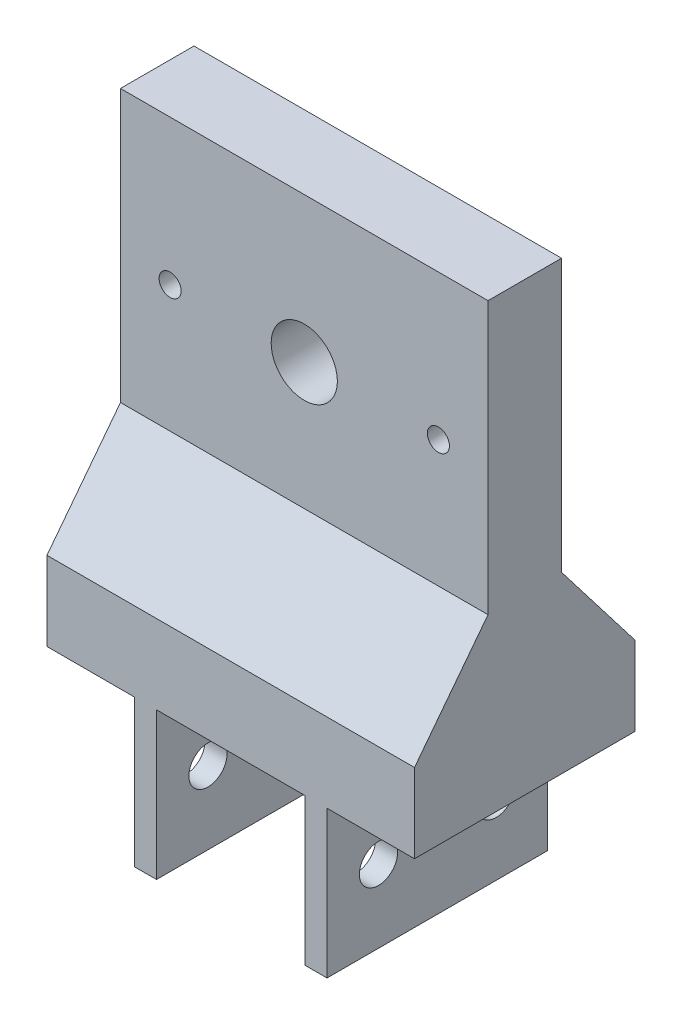
ISO-10303-21;
HEADER;
FILE_DESCRIPTION(('STEP AP214'),'2;1');
FILE_NAME('part.step','',(''),(''),'','','');
FILE_SCHEMA(('AUTOMOTIVE_DESIGN { 1 0 10303 214 1 1 1 1 }'));
ENDSEC;
DATA;
#1=APPLICATION_CONTEXT('core data for automotive mechanical design processes');
#2=APPLICATION_PROTOCOL_DEFINITION('international standard','automotive_design',2000,#1);
#3=PRODUCT_CONTEXT('',#1,'mechanical');
#4=PRODUCT('Part','Part','',(#3));
#5=PRODUCT_RELATED_PRODUCT_CATEGORY('part','',(#4));
#6=PRODUCT_DEFINITION_FORMATION('','',#4);
#7=PRODUCT_DEFINITION_CONTEXT('part definition',#1,'design');
#8=PRODUCT_DEFINITION('design','',#6,#7);
#9=PRODUCT_DEFINITION_SHAPE('','',#8);
#10=(LENGTH_UNIT() NAMED_UNIT(*) SI_UNIT(.MILLI.,.METRE.));
#11=(NAMED_UNIT(*) PLANE_ANGLE_UNIT() SI_UNIT($,.RADIAN.));
#12=(NAMED_UNIT(*) SI_UNIT($,.STERADIAN.) SOLID_ANGLE_UNIT());
#13=UNCERTAINTY_MEASURE_WITH_UNIT(LENGTH_MEASURE(1.E-05),#10,'distance_accuracy_value','');
#14=(GEOMETRIC_REPRESENTATION_CONTEXT(3) GLOBAL_UNCERTAINTY_ASSIGNED_CONTEXT((#13)) GLOBAL_UNIT_ASSIGNED_CONTEXT((#10,
#11,#12)) REPRESENTATION_CONTEXT('',''));
#15=CARTESIAN_POINT('',(0.,0.,0.));
#16=DIRECTION('',(0.,0.,1.));
#17=DIRECTION('',(1.,0.,0.));
#18=AXIS2_PLACEMENT_3D('',#15,#16,#17);
#19=CARTESIAN_POINT('',(13.1,0.,30.));
#20=DIRECTION('',(1.,0.,0.));
#21=DIRECTION('',(0.,1.,0.));
#22=AXIS2_PLACEMENT_3D('',#19,#20,#21);
#23=PLANE('',#22);
#24=CARTESIAN_POINT('',(13.1,-15.375,7.));
#25=DIRECTION('',(1.,0.,0.));
#26=DIRECTION('',(0.,1.,0.));
#27=AXIS2_PLACEMENT_3D('',#24,#25,#26);
#28=CIRCLE('',#27,2.60000000000001);
#29=CARTESIAN_POINT('',(13.1,-12.775,7.));
#30=VERTEX_POINT('',#29);
#31=EDGE_CURVE('E292',#30,#30,#28,.T.);
#32=ORIENTED_EDGE('',*,*,#31,.F.);
#33=EDGE_LOOP('',(#32));
#34=FACE_BOUND('',#33,.T.);
#35=CARTESIAN_POINT('',(13.1,-15.375,23.));
#36=DIRECTION('',(1.,0.,0.));
#37=DIRECTION('',(0.,1.,0.));
#38=AXIS2_PLACEMENT_3D('',#35,#36,#37);
#39=CIRCLE('',#38,2.60000000000001);
#40=CARTESIAN_POINT('',(13.1,-12.775,23.));
#41=VERTEX_POINT('',#40);
#42=EDGE_CURVE('E299',#41,#41,#39,.T.);
#43=ORIENTED_EDGE('',*,*,#42,.F.);
#44=EDGE_LOOP('',(#43));
#45=FACE_BOUND('',#44,.T.);
#46=DIRECTION('',(0.,-1.,0.));
#47=VECTOR('',#46,1.);
#48=CARTESIAN_POINT('',(13.1,0.,0.));
#49=LINE('',#48,#47);
#50=CARTESIAN_POINT('',(13.1,-5.375,0.));
#51=VERTEX_POINT('',#50);
#52=CARTESIAN_POINT('',(13.1,-25.375,0.));
#53=VERTEX_POINT('',#52);
#54=EDGE_CURVE('E199',#51,#53,#49,.T.);
#55=ORIENTED_EDGE('',*,*,#54,.F.);
#56=DIRECTION('',(0.,0.,-1.));
#57=VECTOR('',#56,1.);
#58=CARTESIAN_POINT('',(13.1,-5.375,30.));
#59=LINE('',#58,#57);
#60=CARTESIAN_POINT('',(13.1,-5.375,30.));
#61=VERTEX_POINT('',#60);
#62=EDGE_CURVE('E251',#61,#51,#59,.T.);
#63=ORIENTED_EDGE('',*,*,#62,.F.);
#64=DIRECTION('',(0.,-1.,0.));
#65=VECTOR('',#64,1.);
#66=CARTESIAN_POINT('',(13.1,0.,30.));
#67=LINE('',#66,#65);
#68=CARTESIAN_POINT('',(13.1,-25.375,30.));
#69=VERTEX_POINT('',#68);
#70=EDGE_CURVE('E229',#61,#69,#67,.T.);
#71=ORIENTED_EDGE('',*,*,#70,.T.);
#72=DIRECTION('',(0.,0.,-1.));
#73=VECTOR('',#72,1.);
#74=CARTESIAN_POINT('',(13.1,-25.375,30.));
#75=LINE('',#74,#73);
#76=EDGE_CURVE('E198',#69,#53,#75,.T.);
#77=ORIENTED_EDGE('',*,*,#76,.T.);
#78=EDGE_LOOP('',(#55,#63,#71,#77));
#79=FACE_BOUND('',#78,.T.);
#80=ADVANCED_FACE('F41',(#34,#45,#79),#23,.T.);
#81=CARTESIAN_POINT('',(0.,-5.375,30.));
#82=DIRECTION('',(0.,1.,0.));
#83=DIRECTION('',(0.,0.,1.));
#84=AXIS2_PLACEMENT_3D('',#81,#82,#83);
#85=PLANE('',#84);
#86=DIRECTION('',(1.,0.,0.));
#87=VECTOR('',#86,1.);
#88=CARTESIAN_POINT('',(0.,-5.375,0.));
#89=LINE('',#88,#87);
#90=CARTESIAN_POINT('',(25.,-5.375,0.));
#91=VERTEX_POINT('',#90);
#92=EDGE_CURVE('E202',#51,#91,#89,.T.);
#93=ORIENTED_EDGE('',*,*,#92,.T.);
#94=DIRECTION('',(0.,0.,-1.));
#95=VECTOR('',#94,1.);
#96=CARTESIAN_POINT('',(25.,-5.375,30.));
#97=LINE('',#96,#95);
#98=CARTESIAN_POINT('',(25.,-5.375,30.));
#99=VERTEX_POINT('',#98);
#100=EDGE_CURVE('E248',#99,#91,#97,.T.);
#101=ORIENTED_EDGE('',*,*,#100,.F.);
#102=DIRECTION('',(1.,0.,0.));
#103=VECTOR('',#102,1.);
#104=CARTESIAN_POINT('',(0.,-5.375,30.));
#105=LINE('',#104,#103);
#106=EDGE_CURVE('E320',#61,#99,#105,.T.);
#107=ORIENTED_EDGE('',*,*,#106,.F.);
#108=ORIENTED_EDGE('',*,*,#62,.T.);
#109=EDGE_LOOP('',(#93,#101,#107,#108));
#110=FACE_BOUND('',#109,.T.);
#111=ADVANCED_FACE('F324',(#110),#85,.F.);
#112=CARTESIAN_POINT('',(25.,0.,30.));
#113=DIRECTION('',(-1.,0.,0.));
#114=DIRECTION('',(0.,0.,1.));
#115=AXIS2_PLACEMENT_3D('',#112,#113,#114);
#116=PLANE('',#115);
#117=DIRECTION('',(0.,1.,0.));
#118=VECTOR('',#117,1.);
#119=CARTESIAN_POINT('',(25.,0.,0.));
#120=LINE('',#119,#118);
#121=CARTESIAN_POINT('',(25.,5.375,0.));
#122=VERTEX_POINT('',#121);
#123=EDGE_CURVE('E205',#91,#122,#120,.T.);
#124=ORIENTED_EDGE('',*,*,#123,.T.);
#125=DIRECTION('',(0.,0.7926239891046,0.609710760849693));
#126=VECTOR('',#125,1.);
#127=CARTESIAN_POINT('',(25.,18.375,10.));
#128=LINE('',#127,#126);
#129=CARTESIAN_POINT('',(25.,18.375,10.));
#130=VERTEX_POINT('',#129);
#131=EDGE_CURVE('E386',#122,#130,#128,.T.);
#132=ORIENTED_EDGE('',*,*,#131,.T.);
#133=DIRECTION('',(0.,-1.,0.));
#134=VECTOR('',#133,1.);
#135=CARTESIAN_POINT('',(25.,55.375,10.));
#136=LINE('',#135,#134);
#137=CARTESIAN_POINT('',(25.,55.375,10.));
#138=VERTEX_POINT('',#137);
#139=EDGE_CURVE('E55',#138,#130,#136,.T.);
#140=ORIENTED_EDGE('',*,*,#139,.F.);
#141=DIRECTION('',(0.,0.,-1.));
#142=VECTOR('',#141,1.);
#143=CARTESIAN_POINT('',(25.,55.375,10.));
#144=LINE('',#143,#142);
#145=CARTESIAN_POINT('',(25.,55.375,20.));
#146=VERTEX_POINT('',#145);
#147=EDGE_CURVE('E307',#146,#138,#144,.T.);
#148=ORIENTED_EDGE('',*,*,#147,.F.);
#149=DIRECTION('',(0.,-1.,0.));
#150=VECTOR('',#149,1.);
#151=CARTESIAN_POINT('',(25.,55.375,20.));
#152=LINE('',#151,#150);
#153=CARTESIAN_POINT('',(25.,18.375,20.));
#154=VERTEX_POINT('',#153);
#155=EDGE_CURVE('E314',#146,#154,#152,.T.);
#156=ORIENTED_EDGE('',*,*,#155,.T.);
#157=DIRECTION('',(0.,-0.7926239891046,0.609710760849692));
#158=VECTOR('',#157,1.);
#159=CARTESIAN_POINT('',(25.,18.375,20.));
#160=LINE('',#159,#158);
#161=CARTESIAN_POINT('',(25.,5.375,30.));
#162=VERTEX_POINT('',#161);
#163=EDGE_CURVE('E329',#154,#162,#160,.T.);
#164=ORIENTED_EDGE('',*,*,#163,.T.);
#165=DIRECTION('',(0.,1.,0.));
#166=VECTOR('',#165,1.);
#167=CARTESIAN_POINT('',(25.,0.,30.));
#168=LINE('',#167,#166);
#169=EDGE_CURVE('E173',#99,#162,#168,.T.);
#170=ORIENTED_EDGE('',*,*,#169,.F.);
#171=ORIENTED_EDGE('',*,*,#100,.T.);
#172=EDGE_LOOP('',(#124,#132,#140,#148,#156,#164,#170,#171));
#173=FACE_BOUND('',#172,.T.);
#174=ADVANCED_FACE('F328',(#173),#116,.F.);
#175=CARTESIAN_POINT('',(-25.,0.,30.));
#176=DIRECTION('',(-1.,0.,0.));
#177=DIRECTION('',(0.,0.,1.));
#178=AXIS2_PLACEMENT_3D('',#175,#176,#177);
#179=PLANE('',#178);
#180=DIRECTION('',(0.,-0.7926239891046,-0.609710760849693));
#181=VECTOR('',#180,1.);
#182=CARTESIAN_POINT('',(-25.,18.375,10.));
#183=LINE('',#182,#181);
#184=CARTESIAN_POINT('',(-25.,18.375,10.));
#185=VERTEX_POINT('',#184);
#186=CARTESIAN_POINT('',(-25.,5.375,0.));
#187=VERTEX_POINT('',#186);
#188=EDGE_CURVE('E165',#185,#187,#183,.T.);
#189=ORIENTED_EDGE('',*,*,#188,.T.);
#190=DIRECTION('',(0.,1.,0.));
#191=VECTOR('',#190,1.);
#192=CARTESIAN_POINT('',(-25.,0.,0.));
#193=LINE('',#192,#191);
#194=CARTESIAN_POINT('',(-25.,-5.375,0.));
#195=VERTEX_POINT('',#194);
#196=EDGE_CURVE('E210',#195,#187,#193,.T.);
#197=ORIENTED_EDGE('',*,*,#196,.F.);
#198=DIRECTION('',(0.,0.,-1.));
#199=VECTOR('',#198,1.);
#200=CARTESIAN_POINT('',(-25.,-5.375,30.));
#201=LINE('',#200,#199);
#202=CARTESIAN_POINT('',(-25.,-5.375,30.));
#203=VERTEX_POINT('',#202);
#204=EDGE_CURVE('E178',#203,#195,#201,.T.);
#205=ORIENTED_EDGE('',*,*,#204,.F.);
#206=DIRECTION('',(0.,1.,0.));
#207=VECTOR('',#206,1.);
#208=CARTESIAN_POINT('',(-25.,0.,30.));
#209=LINE('',#208,#207);
#210=CARTESIAN_POINT('',(-25.,5.375,30.));
#211=VERTEX_POINT('',#210);
#212=EDGE_CURVE('E171',#203,#211,#209,.T.);
#213=ORIENTED_EDGE('',*,*,#212,.T.);
#214=DIRECTION('',(0.,0.7926239891046,-0.609710760849692));
#215=VECTOR('',#214,1.);
#216=CARTESIAN_POINT('',(-25.,18.375,20.));
#217=LINE('',#216,#215);
#218=CARTESIAN_POINT('',(-25.,18.375,20.));
#219=VERTEX_POINT('',#218);
#220=EDGE_CURVE('E154',#211,#219,#217,.T.);
#221=ORIENTED_EDGE('',*,*,#220,.T.);
#222=DIRECTION('',(0.,-1.,0.));
#223=VECTOR('',#222,1.);
#224=CARTESIAN_POINT('',(-25.,55.375,20.));
#225=LINE('',#224,#223);
#226=CARTESIAN_POINT('',(-25.,55.375,20.));
#227=VERTEX_POINT('',#226);
#228=EDGE_CURVE('E203',#227,#219,#225,.T.);
#229=ORIENTED_EDGE('',*,*,#228,.F.);
#230=DIRECTION('',(0.,0.,1.));
#231=VECTOR('',#230,1.);
#232=CARTESIAN_POINT('',(-25.,55.375,10.));
#233=LINE('',#232,#231);
#234=CARTESIAN_POINT('',(-25.,55.375,10.));
#235=VERTEX_POINT('',#234);
#236=EDGE_CURVE('E302',#235,#227,#233,.T.);
#237=ORIENTED_EDGE('',*,*,#236,.F.);
#238=DIRECTION('',(0.,-1.,0.));
#239=VECTOR('',#238,1.);
#240=CARTESIAN_POINT('',(-25.,55.375,10.));
#241=LINE('',#240,#239);
#242=EDGE_CURVE('E311',#235,#185,#241,.T.);
#243=ORIENTED_EDGE('',*,*,#242,.T.);
#244=EDGE_LOOP('',(#189,#197,#205,#213,#221,#229,#237,#243));
#245=FACE_BOUND('',#244,.T.);
#246=ADVANCED_FACE('F176',(#245),#179,.T.);
#247=CARTESIAN_POINT('',(0.,-5.375,30.));
#248=DIRECTION('',(0.,1.,0.));
#249=DIRECTION('',(0.,0.,1.));
#250=AXIS2_PLACEMENT_3D('',#247,#248,#249);
#251=PLANE('',#250);
#252=DIRECTION('',(1.,0.,0.));
#253=VECTOR('',#252,1.);
#254=CARTESIAN_POINT('',(0.,-5.375,0.));
#255=LINE('',#254,#253);
#256=CARTESIAN_POINT('',(-13.1,-5.375,0.));
#257=VERTEX_POINT('',#256);
#258=EDGE_CURVE('E212',#195,#257,#255,.T.);
#259=ORIENTED_EDGE('',*,*,#258,.T.);
#260=DIRECTION('',(0.,0.,-1.));
#261=VECTOR('',#260,1.);
#262=CARTESIAN_POINT('',(-13.1,-5.375,30.));
#263=LINE('',#262,#261);
#264=CARTESIAN_POINT('',(-13.1,-5.375,30.));
#265=VERTEX_POINT('',#264);
#266=EDGE_CURVE('E244',#265,#257,#263,.T.);
#267=ORIENTED_EDGE('',*,*,#266,.F.);
#268=DIRECTION('',(1.,0.,0.));
#269=VECTOR('',#268,1.);
#270=CARTESIAN_POINT('',(0.,-5.375,30.));
#271=LINE('',#270,#269);
#272=EDGE_CURVE('E180',#203,#265,#271,.T.);
#273=ORIENTED_EDGE('',*,*,#272,.F.);
#274=ORIENTED_EDGE('',*,*,#204,.T.);
#275=EDGE_LOOP('',(#259,#267,#273,#274));
#276=FACE_BOUND('',#275,.T.);
#277=ADVANCED_FACE('F429',(#276),#251,.F.);
#278=CARTESIAN_POINT('',(-13.1,0.,30.));
#279=DIRECTION('',(1.,0.,0.));
#280=DIRECTION('',(0.,1.,0.));
#281=AXIS2_PLACEMENT_3D('',#278,#279,#280);
#282=PLANE('',#281);
#283=CARTESIAN_POINT('',(-13.1,-15.375,7.));
#284=DIRECTION('',(-1.,0.,0.));
#285=DIRECTION('',(0.,0.,1.));
#286=AXIS2_PLACEMENT_3D('',#283,#284,#285);
#287=CIRCLE('',#286,2.60000000000001);
#288=CARTESIAN_POINT('',(-13.1,-15.375,9.60000000000001));
#289=VERTEX_POINT('',#288);
#290=EDGE_CURVE('E261',#289,#289,#287,.T.);
#291=ORIENTED_EDGE('',*,*,#290,.F.);
#292=EDGE_LOOP('',(#291));
#293=FACE_BOUND('',#292,.T.);
#294=CARTESIAN_POINT('',(-13.1,-15.375,23.));
#295=DIRECTION('',(-1.,0.,0.));
#296=DIRECTION('',(0.,0.,1.));
#297=AXIS2_PLACEMENT_3D('',#294,#295,#296);
#298=CIRCLE('',#297,2.60000000000001);
#299=CARTESIAN_POINT('',(-13.1,-15.375,25.6));
#300=VERTEX_POINT('',#299);
#301=EDGE_CURVE('E257',#300,#300,#298,.T.);
#302=ORIENTED_EDGE('',*,*,#301,.F.);
#303=EDGE_LOOP('',(#302));
#304=FACE_BOUND('',#303,.T.);
#305=DIRECTION('',(0.,-1.,0.));
#306=VECTOR('',#305,1.);
#307=CARTESIAN_POINT('',(-13.1,0.,0.));
#308=LINE('',#307,#306);
#309=CARTESIAN_POINT('',(-13.1,-25.375,0.));
#310=VERTEX_POINT('',#309);
#311=EDGE_CURVE('E214',#257,#310,#308,.T.);
#312=ORIENTED_EDGE('',*,*,#311,.T.);
#313=DIRECTION('',(0.,0.,-1.));
#314=VECTOR('',#313,1.);
#315=CARTESIAN_POINT('',(-13.1,-25.375,30.));
#316=LINE('',#315,#314);
#317=CARTESIAN_POINT('',(-13.1,-25.375,30.));
#318=VERTEX_POINT('',#317);
#319=EDGE_CURVE('E241',#318,#310,#316,.T.);
#320=ORIENTED_EDGE('',*,*,#319,.F.);
#321=DIRECTION('',(0.,-1.,0.));
#322=VECTOR('',#321,1.);
#323=CARTESIAN_POINT('',(-13.1,0.,30.));
#324=LINE('',#323,#322);
#325=EDGE_CURVE('E182',#265,#318,#324,.T.);
#326=ORIENTED_EDGE('',*,*,#325,.F.);
#327=ORIENTED_EDGE('',*,*,#266,.T.);
#328=EDGE_LOOP('',(#312,#320,#326,#327));
#329=FACE_BOUND('',#328,.T.);
#330=ADVANCED_FACE('F425',(#293,#304,#329),#282,.F.);
#331=CARTESIAN_POINT('',(0.,-25.375,30.));
#332=DIRECTION('',(0.,1.,0.));
#333=DIRECTION('',(0.,0.,1.));
#334=AXIS2_PLACEMENT_3D('',#331,#332,#333);
#335=PLANE('',#334);
#336=DIRECTION('',(1.,0.,0.));
#337=VECTOR('',#336,1.);
#338=CARTESIAN_POINT('',(0.,-25.375,0.));
#339=LINE('',#338,#337);
#340=CARTESIAN_POINT('',(-10.1,-25.375,0.));
#341=VERTEX_POINT('',#340);
#342=EDGE_CURVE('E216',#310,#341,#339,.T.);
#343=ORIENTED_EDGE('',*,*,#342,.T.);
#344=DIRECTION('',(0.,0.,-1.));
#345=VECTOR('',#344,1.);
#346=CARTESIAN_POINT('',(-10.1,-25.375,30.));
#347=LINE('',#346,#345);
#348=CARTESIAN_POINT('',(-10.1,-25.375,30.));
#349=VERTEX_POINT('',#348);
#350=EDGE_CURVE('E238',#349,#341,#347,.T.);
#351=ORIENTED_EDGE('',*,*,#350,.F.);
#352=DIRECTION('',(1.,0.,0.));
#353=VECTOR('',#352,1.);
#354=CARTESIAN_POINT('',(0.,-25.375,30.));
#355=LINE('',#354,#353);
#356=EDGE_CURVE('E187',#318,#349,#355,.T.);
#357=ORIENTED_EDGE('',*,*,#356,.F.);
#358=ORIENTED_EDGE('',*,*,#319,.T.);
#359=EDGE_LOOP('',(#343,#351,#357,#358));
#360=FACE_BOUND('',#359,.T.);
#361=ADVANCED_FACE('F421',(#360),#335,.F.);
#362=CARTESIAN_POINT('',(-10.1,0.,30.));
#363=DIRECTION('',(-1.,0.,0.));
#364=DIRECTION('',(0.,0.,1.));
#365=AXIS2_PLACEMENT_3D('',#362,#363,#364);
#366=PLANE('',#365);
#367=CARTESIAN_POINT('',(-10.1,-15.375,7.));
#368=DIRECTION('',(-1.,0.,0.));
#369=DIRECTION('',(0.,0.,1.));
#370=AXIS2_PLACEMENT_3D('',#367,#368,#369);
#371=CIRCLE('',#370,2.60000000000001);
#372=CARTESIAN_POINT('',(-10.1,-15.375,9.60000000000001));
#373=VERTEX_POINT('',#372);
#374=EDGE_CURVE('E258',#373,#373,#371,.T.);
#375=ORIENTED_EDGE('',*,*,#374,.T.);
#376=EDGE_LOOP('',(#375));
#377=FACE_BOUND('',#376,.T.);
#378=CARTESIAN_POINT('',(-10.1,-15.375,23.));
#379=DIRECTION('',(-1.,0.,0.));
#380=DIRECTION('',(0.,0.,1.));
#381=AXIS2_PLACEMENT_3D('',#378,#379,#380);
#382=CIRCLE('',#381,2.60000000000001);
#383=CARTESIAN_POINT('',(-10.1,-15.375,25.6));
#384=VERTEX_POINT('',#383);
#385=EDGE_CURVE('E253',#384,#384,#382,.T.);
#386=ORIENTED_EDGE('',*,*,#385,.T.);
#387=EDGE_LOOP('',(#386));
#388=FACE_BOUND('',#387,.T.);
#389=DIRECTION('',(0.,1.,0.));
#390=VECTOR('',#389,1.);
#391=CARTESIAN_POINT('',(-10.1,0.,0.));
#392=LINE('',#391,#390);
#393=CARTESIAN_POINT('',(-10.1,-5.375,0.));
#394=VERTEX_POINT('',#393);
#395=EDGE_CURVE('E218',#341,#394,#392,.T.);
#396=ORIENTED_EDGE('',*,*,#395,.T.);
#397=DIRECTION('',(0.,0.,-1.));
#398=VECTOR('',#397,1.);
#399=CARTESIAN_POINT('',(-10.1,-5.375,30.));
#400=LINE('',#399,#398);
#401=CARTESIAN_POINT('',(-10.1,-5.375,30.));
#402=VERTEX_POINT('',#401);
#403=EDGE_CURVE('E235',#402,#394,#400,.T.);
#404=ORIENTED_EDGE('',*,*,#403,.F.);
#405=DIRECTION('',(0.,1.,0.));
#406=VECTOR('',#405,1.);
#407=CARTESIAN_POINT('',(-10.1,0.,30.));
#408=LINE('',#407,#406);
#409=EDGE_CURVE('E189',#349,#402,#408,.T.);
#410=ORIENTED_EDGE('',*,*,#409,.F.);
#411=ORIENTED_EDGE('',*,*,#350,.T.);
#412=EDGE_LOOP('',(#396,#404,#410,#411));
#413=FACE_BOUND('',#412,.T.);
#414=ADVANCED_FACE('F417',(#377,#388,#413),#366,.F.);
#415=CARTESIAN_POINT('',(0.,-5.375,30.));
#416=DIRECTION('',(0.,1.,0.));
#417=DIRECTION('',(0.,0.,1.));
#418=AXIS2_PLACEMENT_3D('',#415,#416,#417);
#419=PLANE('',#418);
#420=DIRECTION('',(1.,0.,0.));
#421=VECTOR('',#420,1.);
#422=CARTESIAN_POINT('',(0.,-5.375,0.));
#423=LINE('',#422,#421);
#424=CARTESIAN_POINT('',(10.1,-5.375,0.));
#425=VERTEX_POINT('',#424);
#426=EDGE_CURVE('E220',#394,#425,#423,.T.);
#427=ORIENTED_EDGE('',*,*,#426,.T.);
#428=DIRECTION('',(0.,0.,-1.));
#429=VECTOR('',#428,1.);
#430=CARTESIAN_POINT('',(10.1,-5.375,30.));
#431=LINE('',#430,#429);
#432=CARTESIAN_POINT('',(10.1,-5.375,30.));
#433=VERTEX_POINT('',#432);
#434=EDGE_CURVE('E233',#433,#425,#431,.T.);
#435=ORIENTED_EDGE('',*,*,#434,.F.);
#436=DIRECTION('',(1.,0.,0.));
#437=VECTOR('',#436,1.);
#438=CARTESIAN_POINT('',(0.,-5.375,30.));
#439=LINE('',#438,#437);
#440=EDGE_CURVE('E191',#402,#433,#439,.T.);
#441=ORIENTED_EDGE('',*,*,#440,.F.);
#442=ORIENTED_EDGE('',*,*,#403,.T.);
#443=EDGE_LOOP('',(#427,#435,#441,#442));
#444=FACE_BOUND('',#443,.T.);
#445=ADVANCED_FACE('F413',(#444),#419,.F.);
#446=CARTESIAN_POINT('',(10.1,0.,30.));
#447=DIRECTION('',(-1.,0.,0.));
#448=DIRECTION('',(0.,0.,1.));
#449=AXIS2_PLACEMENT_3D('',#446,#447,#448);
#450=PLANE('',#449);
#451=CARTESIAN_POINT('',(10.1,-15.375,7.));
#452=DIRECTION('',(-1.,0.,0.));
#453=DIRECTION('',(0.,0.,1.));
#454=AXIS2_PLACEMENT_3D('',#451,#452,#453);
#455=CIRCLE('',#454,2.60000000000001);
#456=CARTESIAN_POINT('',(10.1,-15.375,9.60000000000001));
#457=VERTEX_POINT('',#456);
#458=EDGE_CURVE('E260',#457,#457,#455,.T.);
#459=ORIENTED_EDGE('',*,*,#458,.F.);
#460=EDGE_LOOP('',(#459));
#461=FACE_BOUND('',#460,.T.);
#462=CARTESIAN_POINT('',(10.1,-15.375,23.));
#463=DIRECTION('',(-1.,0.,0.));
#464=DIRECTION('',(0.,0.,1.));
#465=AXIS2_PLACEMENT_3D('',#462,#463,#464);
#466=CIRCLE('',#465,2.60000000000001);
#467=CARTESIAN_POINT('',(10.1,-15.375,25.6));
#468=VERTEX_POINT('',#467);
#469=EDGE_CURVE('E256',#468,#468,#466,.T.);
#470=ORIENTED_EDGE('',*,*,#469,.F.);
#471=EDGE_LOOP('',(#470));
#472=FACE_BOUND('',#471,.T.);
#473=DIRECTION('',(0.,1.,0.));
#474=VECTOR('',#473,1.);
#475=CARTESIAN_POINT('',(10.1,0.,0.));
#476=LINE('',#475,#474);
#477=CARTESIAN_POINT('',(10.1,-25.375,0.));
#478=VERTEX_POINT('',#477);
#479=EDGE_CURVE('E223',#478,#425,#476,.T.);
#480=ORIENTED_EDGE('',*,*,#479,.F.);
#481=DIRECTION('',(0.,0.,-1.));
#482=VECTOR('',#481,1.);
#483=CARTESIAN_POINT('',(10.1,-25.375,30.));
#484=LINE('',#483,#482);
#485=CARTESIAN_POINT('',(10.1,-25.375,30.));
#486=VERTEX_POINT('',#485);
#487=EDGE_CURVE('E231',#486,#478,#484,.T.);
#488=ORIENTED_EDGE('',*,*,#487,.F.);
#489=DIRECTION('',(0.,1.,0.));
#490=VECTOR('',#489,1.);
#491=CARTESIAN_POINT('',(10.1,0.,30.));
#492=LINE('',#491,#490);
#493=EDGE_CURVE('E193',#486,#433,#492,.T.);
#494=ORIENTED_EDGE('',*,*,#493,.T.);
#495=ORIENTED_EDGE('',*,*,#434,.T.);
#496=EDGE_LOOP('',(#480,#488,#494,#495));
#497=FACE_BOUND('',#496,.T.);
#498=ADVANCED_FACE('F409',(#461,#472,#497),#450,.T.);
#499=CARTESIAN_POINT('',(0.,-25.375,30.));
#500=DIRECTION('',(0.,1.,0.));
#501=DIRECTION('',(0.,0.,1.));
#502=AXIS2_PLACEMENT_3D('',#499,#500,#501);
#503=PLANE('',#502);
#504=DIRECTION('',(1.,0.,0.));
#505=VECTOR('',#504,1.);
#506=CARTESIAN_POINT('',(0.,-25.375,0.));
#507=LINE('',#506,#505);
#508=EDGE_CURVE('E226',#478,#53,#507,.T.);
#509=ORIENTED_EDGE('',*,*,#508,.T.);
#510=ORIENTED_EDGE('',*,*,#76,.F.);
#511=DIRECTION('',(1.,0.,0.));
#512=VECTOR('',#511,1.);
#513=CARTESIAN_POINT('',(0.,-25.375,30.));
#514=LINE('',#513,#512);
#515=EDGE_CURVE('E196',#486,#69,#514,.T.);
#516=ORIENTED_EDGE('',*,*,#515,.F.);
#517=ORIENTED_EDGE('',*,*,#487,.T.);
#518=EDGE_LOOP('',(#509,#510,#516,#517));
#519=FACE_BOUND('',#518,.T.);
#520=ADVANCED_FACE('F405',(#519),#503,.F.);
#521=CARTESIAN_POINT('',(0.,0.,30.));
#522=DIRECTION('',(0.,0.,1.));
#523=DIRECTION('',(1.,0.,0.));
#524=AXIS2_PLACEMENT_3D('',#521,#522,#523);
#525=PLANE('',#524);
#526=ORIENTED_EDGE('',*,*,#70,.F.);
#527=ORIENTED_EDGE('',*,*,#106,.T.);
#528=ORIENTED_EDGE('',*,*,#169,.T.);
#529=DIRECTION('',(1.,0.,0.));
#530=VECTOR('',#529,1.);
#531=CARTESIAN_POINT('',(0.,5.375,30.));
#532=LINE('',#531,#530);
#533=EDGE_CURVE('E157',#211,#162,#532,.T.);
#534=ORIENTED_EDGE('',*,*,#533,.F.);
#535=ORIENTED_EDGE('',*,*,#212,.F.);
#536=ORIENTED_EDGE('',*,*,#272,.T.);
#537=ORIENTED_EDGE('',*,*,#325,.T.);
#538=ORIENTED_EDGE('',*,*,#356,.T.);
#539=ORIENTED_EDGE('',*,*,#409,.T.);
#540=ORIENTED_EDGE('',*,*,#440,.T.);
#541=ORIENTED_EDGE('',*,*,#493,.F.);
#542=ORIENTED_EDGE('',*,*,#515,.T.);
#543=EDGE_LOOP('',(#526,#527,#528,#534,#535,#536,#537,#538,#539,#540,#541,#542));
#544=FACE_BOUND('',#543,.T.);
#545=ADVANCED_FACE('F170',(#544),#525,.T.);
#546=CARTESIAN_POINT('',(0.,0.,0.));
#547=DIRECTION('',(0.,0.,1.));
#548=DIRECTION('',(1.,0.,0.));
#549=AXIS2_PLACEMENT_3D('',#546,#547,#548);
#550=PLANE('',#549);
#551=ORIENTED_EDGE('',*,*,#54,.T.);
#552=ORIENTED_EDGE('',*,*,#508,.F.);
#553=ORIENTED_EDGE('',*,*,#479,.T.);
#554=ORIENTED_EDGE('',*,*,#426,.F.);
#555=ORIENTED_EDGE('',*,*,#395,.F.);
#556=ORIENTED_EDGE('',*,*,#342,.F.);
#557=ORIENTED_EDGE('',*,*,#311,.F.);
#558=ORIENTED_EDGE('',*,*,#258,.F.);
#559=ORIENTED_EDGE('',*,*,#196,.T.);
#560=DIRECTION('',(1.,0.,0.));
#561=VECTOR('',#560,1.);
#562=CARTESIAN_POINT('',(0.,5.375,0.));
#563=LINE('',#562,#561);
#564=EDGE_CURVE('E207',#187,#122,#563,.T.);
#565=ORIENTED_EDGE('',*,*,#564,.T.);
#566=ORIENTED_EDGE('',*,*,#123,.F.);
#567=ORIENTED_EDGE('',*,*,#92,.F.);
#568=EDGE_LOOP('',(#551,#552,#553,#554,#555,#556,#557,#558,#559,#565,#566,#567));
#569=FACE_BOUND('',#568,.T.);
#570=ADVANCED_FACE('F382',(#569),#550,.F.);
#571=CARTESIAN_POINT('',(-25.,55.375,20.));
#572=DIRECTION('',(0.,0.,-1.));
#573=DIRECTION('',(-1.,0.,0.));
#574=AXIS2_PLACEMENT_3D('',#571,#572,#573);
#575=PLANE('',#574);
#576=CARTESIAN_POINT('',(-18.25,35.625,20.));
#577=DIRECTION('',(0.,0.,-1.));
#578=DIRECTION('',(-1.,0.,0.));
#579=AXIS2_PLACEMENT_3D('',#576,#577,#578);
#580=CIRCLE('',#579,1.50000000000001);
#581=CARTESIAN_POINT('',(-19.75,35.625,20.));
#582=VERTEX_POINT('',#581);
#583=EDGE_CURVE('E335',#582,#582,#580,.T.);
#584=ORIENTED_EDGE('',*,*,#583,.T.);
#585=EDGE_LOOP('',(#584));
#586=FACE_BOUND('',#585,.T.);
#587=CARTESIAN_POINT('',(18.25,35.625,20.));
#588=DIRECTION('',(0.,0.,-1.));
#589=DIRECTION('',(-1.,0.,0.));
#590=AXIS2_PLACEMENT_3D('',#587,#588,#589);
#591=CIRCLE('',#590,1.50000000000001);
#592=CARTESIAN_POINT('',(16.75,35.625,20.));
#593=VERTEX_POINT('',#592);
#594=EDGE_CURVE('E346',#593,#593,#591,.T.);
#595=ORIENTED_EDGE('',*,*,#594,.T.);
#596=EDGE_LOOP('',(#595));
#597=FACE_BOUND('',#596,.T.);
#598=CARTESIAN_POINT('',(0.,35.625,20.));
#599=DIRECTION('',(0.,0.,-1.));
#600=DIRECTION('',(-1.,0.,0.));
#601=AXIS2_PLACEMENT_3D('',#598,#599,#600);
#602=CIRCLE('',#601,4.50000000000001);
#603=CARTESIAN_POINT('',(-4.50000000000002,35.625,20.));
#604=VERTEX_POINT('',#603);
#605=EDGE_CURVE('E278',#604,#604,#602,.T.);
#606=ORIENTED_EDGE('',*,*,#605,.T.);
#607=EDGE_LOOP('',(#606));
#608=FACE_BOUND('',#607,.T.);
#609=ORIENTED_EDGE('',*,*,#228,.T.);
#610=DIRECTION('',(-1.,0.,0.));
#611=VECTOR('',#610,1.);
#612=CARTESIAN_POINT('',(41.4012194668567,18.375,20.));
#613=LINE('',#612,#611);
#614=EDGE_CURVE('E160',#154,#219,#613,.T.);
#615=ORIENTED_EDGE('',*,*,#614,.F.);
#616=ORIENTED_EDGE('',*,*,#155,.F.);
#617=DIRECTION('',(1.,0.,0.));
#618=VECTOR('',#617,1.);
#619=CARTESIAN_POINT('',(-25.,55.375,20.));
#620=LINE('',#619,#618);
#621=EDGE_CURVE('E305',#227,#146,#620,.T.);
#622=ORIENTED_EDGE('',*,*,#621,.F.);
#623=EDGE_LOOP('',(#609,#615,#616,#622));
#624=FACE_BOUND('',#623,.T.);
#625=ADVANCED_FACE('F271',(#586,#597,#608,#624),#575,.F.);
#626=CARTESIAN_POINT('',(-25.,55.375,10.));
#627=DIRECTION('',(0.,0.,1.));
#628=DIRECTION('',(1.,0.,0.));
#629=AXIS2_PLACEMENT_3D('',#626,#627,#628);
#630=PLANE('',#629);
#631=CARTESIAN_POINT('',(18.25,35.625,10.));
#632=DIRECTION('',(0.,0.,1.));
#633=DIRECTION('',(1.,0.,0.));
#634=AXIS2_PLACEMENT_3D('',#631,#632,#633);
#635=CIRCLE('',#634,2.45);
#636=CARTESIAN_POINT('',(20.7,35.625,10.));
#637=VERTEX_POINT('',#636);
#638=EDGE_CURVE('E11',#637,#637,#635,.F.);
#639=ORIENTED_EDGE('',*,*,#638,.F.);
#640=EDGE_LOOP('',(#639));
#641=FACE_BOUND('',#640,.T.);
#642=CARTESIAN_POINT('',(-18.25,35.625,10.));
#643=DIRECTION('',(0.,0.,1.));
#644=DIRECTION('',(1.,0.,0.));
#645=AXIS2_PLACEMENT_3D('',#642,#643,#644);
#646=CIRCLE('',#645,2.45);
#647=CARTESIAN_POINT('',(-15.8,35.625,10.));
#648=VERTEX_POINT('',#647);
#649=EDGE_CURVE('E48',#648,#648,#646,.F.);
#650=ORIENTED_EDGE('',*,*,#649,.F.);
#651=EDGE_LOOP('',(#650));
#652=FACE_BOUND('',#651,.T.);
#653=CARTESIAN_POINT('',(0.,35.625,10.));
#654=DIRECTION('',(0.,0.,-1.));
#655=DIRECTION('',(-1.,0.,0.));
#656=AXIS2_PLACEMENT_3D('',#653,#654,#655);
#657=CIRCLE('',#656,4.50000000000001);
#658=CARTESIAN_POINT('',(-4.50000000000002,35.625,10.));
#659=VERTEX_POINT('',#658);
#660=EDGE_CURVE('E276',#659,#659,#657,.T.);
#661=ORIENTED_EDGE('',*,*,#660,.F.);
#662=EDGE_LOOP('',(#661));
#663=FACE_BOUND('',#662,.T.);
#664=ORIENTED_EDGE('',*,*,#139,.T.);
#665=DIRECTION('',(-1.,0.,0.));
#666=VECTOR('',#665,1.);
#667=CARTESIAN_POINT('',(41.4012194668567,18.375,10.));
#668=LINE('',#667,#666);
#669=EDGE_CURVE('E60',#130,#185,#668,.T.);
#670=ORIENTED_EDGE('',*,*,#669,.T.);
#671=ORIENTED_EDGE('',*,*,#242,.F.);
#672=DIRECTION('',(-1.,0.,0.));
#673=VECTOR('',#672,1.);
#674=CARTESIAN_POINT('',(-25.,55.375,10.));
#675=LINE('',#674,#673);
#676=EDGE_CURVE('E309',#138,#235,#675,.T.);
#677=ORIENTED_EDGE('',*,*,#676,.F.);
#678=EDGE_LOOP('',(#664,#670,#671,#677));
#679=FACE_BOUND('',#678,.T.);
#680=ADVANCED_FACE('F267',(#641,#652,#663,#679),#630,.F.);
#681=CARTESIAN_POINT('',(0.,55.375,0.));
#682=DIRECTION('',(0.,1.,0.));
#683=DIRECTION('',(0.,0.,1.));
#684=AXIS2_PLACEMENT_3D('',#681,#682,#683);
#685=PLANE('',#684);
#686=ORIENTED_EDGE('',*,*,#236,.T.);
#687=ORIENTED_EDGE('',*,*,#621,.T.);
#688=ORIENTED_EDGE('',*,*,#147,.T.);
#689=ORIENTED_EDGE('',*,*,#676,.T.);
#690=EDGE_LOOP('',(#686,#687,#688,#689));
#691=FACE_BOUND('',#690,.T.);
#692=ADVANCED_FACE('F270',(#691),#685,.T.);
#693=CARTESIAN_POINT('',(-13.1,-15.375,23.));
#694=DIRECTION('',(-1.,0.,0.));
#695=DIRECTION('',(0.,0.,1.));
#696=AXIS2_PLACEMENT_3D('',#693,#694,#695);
#697=CYLINDRICAL_SURFACE('',#696,2.60000000000001);
#698=ORIENTED_EDGE('',*,*,#301,.T.);
#699=EDGE_LOOP('',(#698));
#700=FACE_BOUND('',#699,.T.);
#701=ORIENTED_EDGE('',*,*,#385,.F.);
#702=EDGE_LOOP('',(#701));
#703=FACE_BOUND('',#702,.T.);
#704=ADVANCED_FACE('F575',(#700,#703),#697,.F.);
#705=ORIENTED_EDGE('',*,*,#42,.T.);
#706=EDGE_LOOP('',(#705));
#707=FACE_BOUND('',#706,.T.);
#708=ORIENTED_EDGE('',*,*,#469,.T.);
#709=EDGE_LOOP('',(#708));
#710=FACE_BOUND('',#709,.T.);
#711=ADVANCED_FACE('F565',(#707,#710),#697,.F.);
#712=CARTESIAN_POINT('',(-13.1,-15.375,7.));
#713=DIRECTION('',(-1.,0.,0.));
#714=DIRECTION('',(0.,0.,1.));
#715=AXIS2_PLACEMENT_3D('',#712,#713,#714);
#716=CYLINDRICAL_SURFACE('',#715,2.60000000000001);
#717=ORIENTED_EDGE('',*,*,#290,.T.);
#718=EDGE_LOOP('',(#717));
#719=FACE_BOUND('',#718,.T.);
#720=ORIENTED_EDGE('',*,*,#374,.F.);
#721=EDGE_LOOP('',(#720));
#722=FACE_BOUND('',#721,.T.);
#723=ADVANCED_FACE('F554',(#719,#722),#716,.F.);
#724=ORIENTED_EDGE('',*,*,#31,.T.);
#725=EDGE_LOOP('',(#724));
#726=FACE_BOUND('',#725,.T.);
#727=ORIENTED_EDGE('',*,*,#458,.T.);
#728=EDGE_LOOP('',(#727));
#729=FACE_BOUND('',#728,.T.);
#730=ADVANCED_FACE('F544',(#726,#729),#716,.F.);
#731=CARTESIAN_POINT('',(0.,35.625,10.));
#732=DIRECTION('',(0.,0.,-1.));
#733=DIRECTION('',(-1.,0.,0.));
#734=AXIS2_PLACEMENT_3D('',#731,#732,#733);
#735=CYLINDRICAL_SURFACE('',#734,4.50000000000001);
#736=ORIENTED_EDGE('',*,*,#660,.T.);
#737=EDGE_LOOP('',(#736));
#738=FACE_BOUND('',#737,.T.);
#739=ORIENTED_EDGE('',*,*,#605,.F.);
#740=EDGE_LOOP('',(#739));
#741=FACE_BOUND('',#740,.T.);
#742=ADVANCED_FACE('F533',(#738,#741),#735,.F.);
#743=CARTESIAN_POINT('',(-18.25,35.625,6.));
#744=DIRECTION('',(0.,0.,1.));
#745=DIRECTION('',(1.,0.,0.));
#746=AXIS2_PLACEMENT_3D('',#743,#744,#745);
#747=CYLINDRICAL_SURFACE('',#746,2.45);
#748=CARTESIAN_POINT('',(-18.25,35.625,6.));
#749=DIRECTION('',(0.,0.,-1.));
#750=DIRECTION('',(-1.,0.,0.));
#751=AXIS2_PLACEMENT_3D('',#748,#749,#750);
#752=CIRCLE('',#751,2.45);
#753=CARTESIAN_POINT('',(-20.7,35.625,6.));
#754=VERTEX_POINT('',#753);
#755=EDGE_CURVE('E279',#754,#754,#752,.T.);
#756=ORIENTED_EDGE('',*,*,#755,.F.);
#757=EDGE_LOOP('',(#756));
#758=FACE_BOUND('',#757,.T.);
#759=ORIENTED_EDGE('',*,*,#649,.T.);
#760=EDGE_LOOP('',(#759));
#761=FACE_BOUND('',#760,.T.);
#762=ADVANCED_FACE('F265',(#758,#761),#747,.T.);
#763=CARTESIAN_POINT('',(-18.25,35.625,6.));
#764=DIRECTION('',(0.,0.,-1.));
#765=DIRECTION('',(-1.,0.,0.));
#766=AXIS2_PLACEMENT_3D('',#763,#764,#765);
#767=PLANE('',#766);
#768=CARTESIAN_POINT('',(-18.25,35.625,6.));
#769=DIRECTION('',(0.,0.,-1.));
#770=DIRECTION('',(-1.,0.,0.));
#771=AXIS2_PLACEMENT_3D('',#768,#769,#770);
#772=CIRCLE('',#771,1.50000000000002);
#773=CARTESIAN_POINT('',(-19.75,35.625,6.));
#774=VERTEX_POINT('',#773);
#775=EDGE_CURVE('E332',#774,#774,#772,.T.);
#776=ORIENTED_EDGE('',*,*,#775,.F.);
#777=EDGE_LOOP('',(#776));
#778=FACE_BOUND('',#777,.T.);
#779=ORIENTED_EDGE('',*,*,#755,.T.);
#780=EDGE_LOOP('',(#779));
#781=FACE_BOUND('',#780,.T.);
#782=ADVANCED_FACE('F356',(#778,#781),#767,.T.);
#783=CARTESIAN_POINT('',(18.25,35.625,6.));
#784=DIRECTION('',(0.,0.,1.));
#785=DIRECTION('',(1.,0.,0.));
#786=AXIS2_PLACEMENT_3D('',#783,#784,#785);
#787=CYLINDRICAL_SURFACE('',#786,2.45);
#788=CARTESIAN_POINT('',(18.25,35.625,6.));
#789=DIRECTION('',(0.,0.,-1.));
#790=DIRECTION('',(-1.,0.,0.));
#791=AXIS2_PLACEMENT_3D('',#788,#789,#790);
#792=CIRCLE('',#791,2.45);
#793=CARTESIAN_POINT('',(15.8,35.625,6.));
#794=VERTEX_POINT('',#793);
#795=EDGE_CURVE('E284',#794,#794,#792,.T.);
#796=ORIENTED_EDGE('',*,*,#795,.F.);
#797=EDGE_LOOP('',(#796));
#798=FACE_BOUND('',#797,.T.);
#799=ORIENTED_EDGE('',*,*,#638,.T.);
#800=EDGE_LOOP('',(#799));
#801=FACE_BOUND('',#800,.T.);
#802=ADVANCED_FACE('F353',(#798,#801),#787,.T.);
#803=CARTESIAN_POINT('',(18.25,35.625,6.));
#804=DIRECTION('',(0.,0.,-1.));
#805=DIRECTION('',(-1.,0.,0.));
#806=AXIS2_PLACEMENT_3D('',#803,#804,#805);
#807=PLANE('',#806);
#808=CARTESIAN_POINT('',(18.25,35.625,6.));
#809=DIRECTION('',(0.,0.,-1.));
#810=DIRECTION('',(-1.,0.,0.));
#811=AXIS2_PLACEMENT_3D('',#808,#809,#810);
#812=CIRCLE('',#811,1.50000000000002);
#813=CARTESIAN_POINT('',(16.75,35.625,6.));
#814=VERTEX_POINT('',#813);
#815=EDGE_CURVE('E343',#814,#814,#812,.T.);
#816=ORIENTED_EDGE('',*,*,#815,.F.);
#817=EDGE_LOOP('',(#816));
#818=FACE_BOUND('',#817,.T.);
#819=ORIENTED_EDGE('',*,*,#795,.T.);
#820=EDGE_LOOP('',(#819));
#821=FACE_BOUND('',#820,.T.);
#822=ADVANCED_FACE('F351',(#818,#821),#807,.T.);
#823=CARTESIAN_POINT('',(18.25,35.625,6.));
#824=DIRECTION('',(0.,0.,-1.));
#825=DIRECTION('',(-1.,0.,0.));
#826=AXIS2_PLACEMENT_3D('',#823,#824,#825);
#827=CYLINDRICAL_SURFACE('',#826,1.50000000000001);
#828=ORIENTED_EDGE('',*,*,#815,.T.);
#829=EDGE_LOOP('',(#828));
#830=FACE_BOUND('',#829,.T.);
#831=ORIENTED_EDGE('',*,*,#594,.F.);
#832=EDGE_LOOP('',(#831));
#833=FACE_BOUND('',#832,.T.);
#834=ADVANCED_FACE('F363',(#830,#833),#827,.F.);
#835=CARTESIAN_POINT('',(-18.25,35.625,6.));
#836=DIRECTION('',(0.,0.,-1.));
#837=DIRECTION('',(-1.,0.,0.));
#838=AXIS2_PLACEMENT_3D('',#835,#836,#837);
#839=CYLINDRICAL_SURFACE('',#838,1.50000000000001);
#840=ORIENTED_EDGE('',*,*,#775,.T.);
#841=EDGE_LOOP('',(#840));
#842=FACE_BOUND('',#841,.T.);
#843=ORIENTED_EDGE('',*,*,#583,.F.);
#844=EDGE_LOOP('',(#843));
#845=FACE_BOUND('',#844,.T.);
#846=ADVANCED_FACE('F444',(#842,#845),#839,.F.);
#847=CARTESIAN_POINT('',(41.4012194668567,18.375,20.));
#848=DIRECTION('',(0.,0.609710760849692,0.7926239891046));
#849=DIRECTION('',(0.,-0.7926239891046,0.609710760849692));
#850=AXIS2_PLACEMENT_3D('',#847,#848,#849);
#851=PLANE('',#850);
#852=ORIENTED_EDGE('',*,*,#163,.F.);
#853=ORIENTED_EDGE('',*,*,#614,.T.);
#854=ORIENTED_EDGE('',*,*,#220,.F.);
#855=ORIENTED_EDGE('',*,*,#533,.T.);
#856=EDGE_LOOP('',(#852,#853,#854,#855));
#857=FACE_BOUND('',#856,.T.);
#858=ADVANCED_FACE('F156',(#857),#851,.T.);
#859=CARTESIAN_POINT('',(41.4012194668567,18.375,10.));
#860=DIRECTION('',(0.,0.609710760849693,-0.7926239891046));
#861=DIRECTION('',(0.,0.7926239891046,0.609710760849693));
#862=AXIS2_PLACEMENT_3D('',#859,#860,#861);
#863=PLANE('',#862);
#864=ORIENTED_EDGE('',*,*,#131,.F.);
#865=ORIENTED_EDGE('',*,*,#564,.F.);
#866=ORIENTED_EDGE('',*,*,#188,.F.);
#867=ORIENTED_EDGE('',*,*,#669,.F.);
#868=EDGE_LOOP('',(#864,#865,#866,#867));
#869=FACE_BOUND('',#868,.T.);
#870=ADVANCED_FACE('F390',(#869),#863,.T.);
#871=CLOSED_SHELL('',(#80,#111,#174,#246,#277,#330,#361,#414,#445,#498,#520,#545,#570,#625,#680,
#692,#704,#711,#723,#730,#742,#762,#782,#802,#822,#834,#846,#858,#870));
#872=MANIFOLD_SOLID_BREP('B2',#871);
#873=ADVANCED_BREP_SHAPE_REPRESENTATION('',(#18,#872),#14);
#874=SHAPE_DEFINITION_REPRESENTATION(#9,#873);
ENDSEC;
END-ISO-10303-21;
